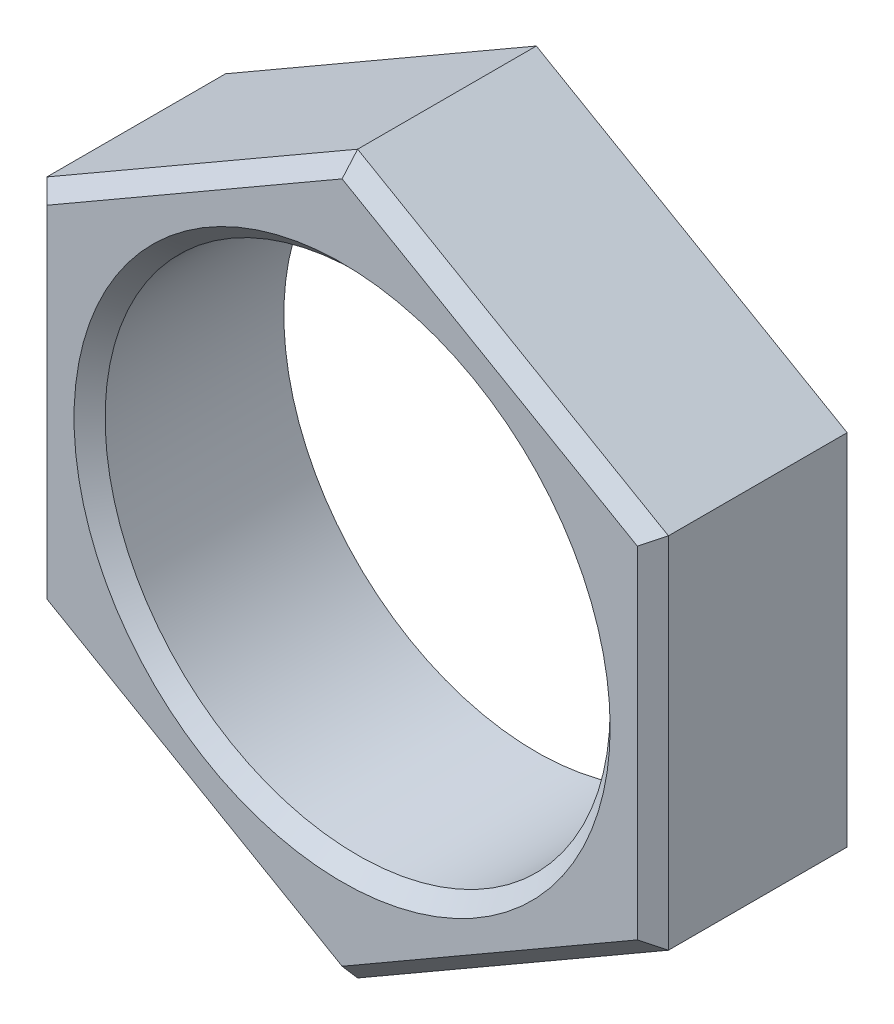
ISO-10303-21;
HEADER;
FILE_DESCRIPTION(('STEP AP214'),'2;1');
FILE_NAME('part.step','',(''),(''),'','','');
FILE_SCHEMA(('AUTOMOTIVE_DESIGN { 1 0 10303 214 1 1 1 1 }'));
ENDSEC;
DATA;
#1=APPLICATION_CONTEXT('core data for automotive mechanical design processes');
#2=APPLICATION_PROTOCOL_DEFINITION('international standard','automotive_design',2000,#1);
#3=PRODUCT_CONTEXT('',#1,'mechanical');
#4=PRODUCT('Part','Part','',(#3));
#5=PRODUCT_RELATED_PRODUCT_CATEGORY('part','',(#4));
#6=PRODUCT_DEFINITION_FORMATION('','',#4);
#7=PRODUCT_DEFINITION_CONTEXT('part definition',#1,'design');
#8=PRODUCT_DEFINITION('design','',#6,#7);
#9=PRODUCT_DEFINITION_SHAPE('','',#8);
#10=(LENGTH_UNIT() NAMED_UNIT(*) SI_UNIT(.MILLI.,.METRE.));
#11=(NAMED_UNIT(*) PLANE_ANGLE_UNIT() SI_UNIT($,.RADIAN.));
#12=(NAMED_UNIT(*) SI_UNIT($,.STERADIAN.) SOLID_ANGLE_UNIT());
#13=UNCERTAINTY_MEASURE_WITH_UNIT(LENGTH_MEASURE(1.E-05),#10,'distance_accuracy_value','');
#14=(GEOMETRIC_REPRESENTATION_CONTEXT(3) GLOBAL_UNCERTAINTY_ASSIGNED_CONTEXT((#13)) GLOBAL_UNIT_ASSIGNED_CONTEXT((#10,
#11,#12)) REPRESENTATION_CONTEXT('',''));
#15=CARTESIAN_POINT('',(0.,0.,0.));
#16=DIRECTION('',(0.,0.,1.));
#17=DIRECTION('',(1.,0.,0.));
#18=AXIS2_PLACEMENT_3D('',#15,#16,#17);
#19=CARTESIAN_POINT('',(0.,0.,15.875));
#20=DIRECTION('',(0.,0.,1.));
#21=DIRECTION('',(1.,0.,0.));
#22=AXIS2_PLACEMENT_3D('',#19,#20,#21);
#23=PLANE('',#22);
#24=CARTESIAN_POINT('',(0.,0.,15.875));
#25=DIRECTION('',(0.,0.,1.));
#26=DIRECTION('',(1.,0.,0.));
#27=AXIS2_PLACEMENT_3D('',#24,#25,#26);
#28=CIRCLE('',#27,21.9075);
#29=CARTESIAN_POINT('',(21.9075,0.,15.875));
#30=VERTEX_POINT('',#29);
#31=EDGE_CURVE('E164',#30,#30,#28,.F.);
#32=ORIENTED_EDGE('',*,*,#31,.T.);
#33=EDGE_LOOP('',(#32));
#34=FACE_BOUND('',#33,.T.);
#35=DIRECTION('',(0.866025403784439,0.5,0.));
#36=VECTOR('',#35,1.);
#37=CARTESIAN_POINT('',(24.765,-13.5648445746103,15.875));
#38=LINE('',#37,#36);
#39=CARTESIAN_POINT('',(0.,-27.8629239910914,15.875));
#40=VERTEX_POINT('',#39);
#41=CARTESIAN_POINT('',(24.13,-13.9314619955457,15.875));
#42=VERTEX_POINT('',#41);
#43=EDGE_CURVE('E159',#40,#42,#38,.T.);
#44=ORIENTED_EDGE('',*,*,#43,.T.);
#45=DIRECTION('',(0.,1.,0.));
#46=VECTOR('',#45,1.);
#47=CARTESIAN_POINT('',(24.13,14.6646968374165,15.875));
#48=LINE('',#47,#46);
#49=CARTESIAN_POINT('',(24.13,13.9314619955457,15.875));
#50=VERTEX_POINT('',#49);
#51=EDGE_CURVE('E161',#42,#50,#48,.T.);
#52=ORIENTED_EDGE('',*,*,#51,.T.);
#53=DIRECTION('',(-0.866025403784439,0.5,0.));
#54=VECTOR('',#53,1.);
#55=CARTESIAN_POINT('',(-0.634999999999995,28.2295414120268,15.875));
#56=LINE('',#55,#54);
#57=CARTESIAN_POINT('',(0.,27.8629239910913,15.875));
#58=VERTEX_POINT('',#57);
#59=EDGE_CURVE('E151',#50,#58,#56,.T.);
#60=ORIENTED_EDGE('',*,*,#59,.T.);
#61=DIRECTION('',(-0.866025403784439,-0.5,0.));
#62=VECTOR('',#61,1.);
#63=CARTESIAN_POINT('',(-24.765,13.5648445746103,15.875));
#64=LINE('',#63,#62);
#65=CARTESIAN_POINT('',(-24.13,13.9314619955457,15.875));
#66=VERTEX_POINT('',#65);
#67=EDGE_CURVE('E153',#58,#66,#64,.T.);
#68=ORIENTED_EDGE('',*,*,#67,.T.);
#69=DIRECTION('',(0.,-1.,0.));
#70=VECTOR('',#69,1.);
#71=CARTESIAN_POINT('',(-24.13,-14.6646968374165,15.875));
#72=LINE('',#71,#70);
#73=CARTESIAN_POINT('',(-24.13,-13.9314619955457,15.875));
#74=VERTEX_POINT('',#73);
#75=EDGE_CURVE('E155',#66,#74,#72,.T.);
#76=ORIENTED_EDGE('',*,*,#75,.T.);
#77=DIRECTION('',(0.866025403784439,-0.5,0.));
#78=VECTOR('',#77,1.);
#79=CARTESIAN_POINT('',(0.634999999999997,-28.2295414120268,15.875));
#80=LINE('',#79,#78);
#81=EDGE_CURVE('E157',#74,#40,#80,.T.);
#82=ORIENTED_EDGE('',*,*,#81,.T.);
#83=EDGE_LOOP('',(#44,#52,#60,#68,#76,#82));
#84=FACE_BOUND('',#83,.T.);
#85=ADVANCED_FACE('F32',(#34,#84),#23,.T.);
#86=CARTESIAN_POINT('',(0.,0.,0.));
#87=DIRECTION('',(0.,0.,1.));
#88=DIRECTION('',(1.,0.,0.));
#89=AXIS2_PLACEMENT_3D('',#86,#87,#88);
#90=PLANE('',#89);
#91=DIRECTION('',(-0.866025403784439,0.5,0.));
#92=VECTOR('',#91,1.);
#93=CARTESIAN_POINT('',(25.4,14.6646968374165,0.));
#94=LINE('',#93,#92);
#95=CARTESIAN_POINT('',(25.4,14.6646968374165,0.));
#96=VERTEX_POINT('',#95);
#97=CARTESIAN_POINT('',(0.,29.329393674833,0.));
#98=VERTEX_POINT('',#97);
#99=EDGE_CURVE('E118',#96,#98,#94,.T.);
#100=ORIENTED_EDGE('',*,*,#99,.F.);
#101=DIRECTION('',(0.,1.,0.));
#102=VECTOR('',#101,1.);
#103=CARTESIAN_POINT('',(25.4,-14.6646968374165,0.));
#104=LINE('',#103,#102);
#105=CARTESIAN_POINT('',(25.4,-14.6646968374165,0.));
#106=VERTEX_POINT('',#105);
#107=EDGE_CURVE('E139',#106,#96,#104,.T.);
#108=ORIENTED_EDGE('',*,*,#107,.F.);
#109=DIRECTION('',(0.866025403784439,0.5,0.));
#110=VECTOR('',#109,1.);
#111=CARTESIAN_POINT('',(0.,-29.329393674833,0.));
#112=LINE('',#111,#110);
#113=CARTESIAN_POINT('',(0.,-29.329393674833,0.));
#114=VERTEX_POINT('',#113);
#115=EDGE_CURVE('E136',#114,#106,#112,.T.);
#116=ORIENTED_EDGE('',*,*,#115,.F.);
#117=DIRECTION('',(0.866025403784439,-0.5,0.));
#118=VECTOR('',#117,1.);
#119=CARTESIAN_POINT('',(-25.4,-14.6646968374165,0.));
#120=LINE('',#119,#118);
#121=CARTESIAN_POINT('',(-25.4,-14.6646968374165,0.));
#122=VERTEX_POINT('',#121);
#123=EDGE_CURVE('E133',#122,#114,#120,.T.);
#124=ORIENTED_EDGE('',*,*,#123,.F.);
#125=DIRECTION('',(0.,-1.,0.));
#126=VECTOR('',#125,1.);
#127=CARTESIAN_POINT('',(-25.4,14.6646968374165,0.));
#128=LINE('',#127,#126);
#129=CARTESIAN_POINT('',(-25.4,14.6646968374165,0.));
#130=VERTEX_POINT('',#129);
#131=EDGE_CURVE('E121',#130,#122,#128,.T.);
#132=ORIENTED_EDGE('',*,*,#131,.F.);
#133=DIRECTION('',(-0.866025403784439,-0.5,0.));
#134=VECTOR('',#133,1.);
#135=CARTESIAN_POINT('',(0.,29.329393674833,0.));
#136=LINE('',#135,#134);
#137=EDGE_CURVE('E105',#98,#130,#136,.T.);
#138=ORIENTED_EDGE('',*,*,#137,.F.);
#139=EDGE_LOOP('',(#100,#108,#116,#124,#132,#138));
#140=FACE_BOUND('',#139,.T.);
#141=CARTESIAN_POINT('',(0.,0.,0.));
#142=DIRECTION('',(0.,0.,1.));
#143=DIRECTION('',(1.,0.,0.));
#144=AXIS2_PLACEMENT_3D('',#141,#142,#143);
#145=CIRCLE('',#144,20.6375);
#146=CARTESIAN_POINT('',(20.6375,0.,0.));
#147=VERTEX_POINT('',#146);
#148=EDGE_CURVE('E127',#147,#147,#145,.T.);
#149=ORIENTED_EDGE('',*,*,#148,.T.);
#150=EDGE_LOOP('',(#149));
#151=FACE_BOUND('',#150,.T.);
#152=ADVANCED_FACE('F115',(#140,#151),#90,.F.);
#153=CARTESIAN_POINT('',(25.4,14.6646968374165,15.875));
#154=DIRECTION('',(-0.5,-0.866025403784439,0.));
#155=DIRECTION('',(0.866025403784439,-0.5,0.));
#156=AXIS2_PLACEMENT_3D('',#153,#154,#155);
#157=PLANE('',#156);
#158=DIRECTION('',(0.,0.,-1.));
#159=VECTOR('',#158,1.);
#160=CARTESIAN_POINT('',(0.,29.329393674833,15.875));
#161=LINE('',#160,#159);
#162=CARTESIAN_POINT('',(0.,29.329393674833,14.605));
#163=VERTEX_POINT('',#162);
#164=EDGE_CURVE('E102',#163,#98,#161,.T.);
#165=ORIENTED_EDGE('',*,*,#164,.F.);
#166=DIRECTION('',(0.866025403784439,-0.5,0.));
#167=VECTOR('',#166,1.);
#168=CARTESIAN_POINT('',(25.4,14.6646968374165,14.605));
#169=LINE('',#168,#167);
#170=CARTESIAN_POINT('',(25.4,14.6646968374165,14.605));
#171=VERTEX_POINT('',#170);
#172=EDGE_CURVE('E11',#163,#171,#169,.T.);
#173=ORIENTED_EDGE('',*,*,#172,.T.);
#174=DIRECTION('',(0.,0.,-1.));
#175=VECTOR('',#174,1.);
#176=CARTESIAN_POINT('',(25.4,14.6646968374165,15.875));
#177=LINE('',#176,#175);
#178=EDGE_CURVE('E125',#171,#96,#177,.T.);
#179=ORIENTED_EDGE('',*,*,#178,.T.);
#180=ORIENTED_EDGE('',*,*,#99,.T.);
#181=EDGE_LOOP('',(#165,#173,#179,#180));
#182=FACE_BOUND('',#181,.T.);
#183=ADVANCED_FACE('F123',(#182),#157,.F.);
#184=CARTESIAN_POINT('',(0.,29.329393674833,15.875));
#185=DIRECTION('',(0.5,-0.866025403784439,0.));
#186=DIRECTION('',(0.866025403784439,0.5,0.));
#187=AXIS2_PLACEMENT_3D('',#184,#185,#186);
#188=PLANE('',#187);
#189=DIRECTION('',(0.,0.,-1.));
#190=VECTOR('',#189,1.);
#191=CARTESIAN_POINT('',(-25.4,14.6646968374165,15.875));
#192=LINE('',#191,#190);
#193=CARTESIAN_POINT('',(-25.4,14.6646968374165,14.605));
#194=VERTEX_POINT('',#193);
#195=EDGE_CURVE('E111',#194,#130,#192,.T.);
#196=ORIENTED_EDGE('',*,*,#195,.F.);
#197=DIRECTION('',(0.866025403784439,0.5,0.));
#198=VECTOR('',#197,1.);
#199=CARTESIAN_POINT('',(0.,29.329393674833,14.605));
#200=LINE('',#199,#198);
#201=EDGE_CURVE('E41',#194,#163,#200,.T.);
#202=ORIENTED_EDGE('',*,*,#201,.T.);
#203=ORIENTED_EDGE('',*,*,#164,.T.);
#204=ORIENTED_EDGE('',*,*,#137,.T.);
#205=EDGE_LOOP('',(#196,#202,#203,#204));
#206=FACE_BOUND('',#205,.T.);
#207=ADVANCED_FACE('F104',(#206),#188,.F.);
#208=CARTESIAN_POINT('',(-25.4,14.6646968374165,15.875));
#209=DIRECTION('',(1.,0.,0.));
#210=DIRECTION('',(0.,0.,-1.));
#211=AXIS2_PLACEMENT_3D('',#208,#209,#210);
#212=PLANE('',#211);
#213=DIRECTION('',(0.,0.,-1.));
#214=VECTOR('',#213,1.);
#215=CARTESIAN_POINT('',(-25.4,-14.6646968374165,15.875));
#216=LINE('',#215,#214);
#217=CARTESIAN_POINT('',(-25.4,-14.6646968374165,14.605));
#218=VERTEX_POINT('',#217);
#219=EDGE_CURVE('E146',#218,#122,#216,.T.);
#220=ORIENTED_EDGE('',*,*,#219,.F.);
#221=DIRECTION('',(0.,1.,0.));
#222=VECTOR('',#221,1.);
#223=CARTESIAN_POINT('',(-25.4,14.6646968374165,14.605));
#224=LINE('',#223,#222);
#225=EDGE_CURVE('E56',#218,#194,#224,.T.);
#226=ORIENTED_EDGE('',*,*,#225,.T.);
#227=ORIENTED_EDGE('',*,*,#195,.T.);
#228=ORIENTED_EDGE('',*,*,#131,.T.);
#229=EDGE_LOOP('',(#220,#226,#227,#228));
#230=FACE_BOUND('',#229,.T.);
#231=ADVANCED_FACE('F223',(#230),#212,.F.);
#232=CARTESIAN_POINT('',(-25.4,-14.6646968374165,15.875));
#233=DIRECTION('',(0.5,0.866025403784439,0.));
#234=DIRECTION('',(-0.866025403784439,0.5,0.));
#235=AXIS2_PLACEMENT_3D('',#232,#233,#234);
#236=PLANE('',#235);
#237=DIRECTION('',(0.,0.,-1.));
#238=VECTOR('',#237,1.);
#239=CARTESIAN_POINT('',(0.,-29.329393674833,15.875));
#240=LINE('',#239,#238);
#241=CARTESIAN_POINT('',(0.,-29.329393674833,14.605));
#242=VERTEX_POINT('',#241);
#243=EDGE_CURVE('E144',#242,#114,#240,.T.);
#244=ORIENTED_EDGE('',*,*,#243,.F.);
#245=DIRECTION('',(-0.866025403784439,0.5,0.));
#246=VECTOR('',#245,1.);
#247=CARTESIAN_POINT('',(-25.4,-14.6646968374165,14.605));
#248=LINE('',#247,#246);
#249=EDGE_CURVE('E172',#242,#218,#248,.T.);
#250=ORIENTED_EDGE('',*,*,#249,.T.);
#251=ORIENTED_EDGE('',*,*,#219,.T.);
#252=ORIENTED_EDGE('',*,*,#123,.T.);
#253=EDGE_LOOP('',(#244,#250,#251,#252));
#254=FACE_BOUND('',#253,.T.);
#255=ADVANCED_FACE('F221',(#254),#236,.F.);
#256=CARTESIAN_POINT('',(0.,-29.329393674833,15.875));
#257=DIRECTION('',(-0.5,0.866025403784439,0.));
#258=DIRECTION('',(-0.866025403784439,-0.5,0.));
#259=AXIS2_PLACEMENT_3D('',#256,#257,#258);
#260=PLANE('',#259);
#261=DIRECTION('',(0.,0.,-1.));
#262=VECTOR('',#261,1.);
#263=CARTESIAN_POINT('',(25.4,-14.6646968374165,15.875));
#264=LINE('',#263,#262);
#265=CARTESIAN_POINT('',(25.4,-14.6646968374165,14.605));
#266=VERTEX_POINT('',#265);
#267=EDGE_CURVE('E142',#266,#106,#264,.T.);
#268=ORIENTED_EDGE('',*,*,#267,.F.);
#269=DIRECTION('',(-0.866025403784439,-0.5,0.));
#270=VECTOR('',#269,1.);
#271=CARTESIAN_POINT('',(0.,-29.329393674833,14.605));
#272=LINE('',#271,#270);
#273=EDGE_CURVE('E170',#266,#242,#272,.T.);
#274=ORIENTED_EDGE('',*,*,#273,.T.);
#275=ORIENTED_EDGE('',*,*,#243,.T.);
#276=ORIENTED_EDGE('',*,*,#115,.T.);
#277=EDGE_LOOP('',(#268,#274,#275,#276));
#278=FACE_BOUND('',#277,.T.);
#279=ADVANCED_FACE('F219',(#278),#260,.F.);
#280=CARTESIAN_POINT('',(25.4,-14.6646968374165,15.875));
#281=DIRECTION('',(-1.,0.,0.));
#282=DIRECTION('',(0.,-1.,0.));
#283=AXIS2_PLACEMENT_3D('',#280,#281,#282);
#284=PLANE('',#283);
#285=ORIENTED_EDGE('',*,*,#178,.F.);
#286=DIRECTION('',(0.,-1.,0.));
#287=VECTOR('',#286,1.);
#288=CARTESIAN_POINT('',(25.4,-14.6646968374165,14.605));
#289=LINE('',#288,#287);
#290=EDGE_CURVE('E167',#171,#266,#289,.T.);
#291=ORIENTED_EDGE('',*,*,#290,.T.);
#292=ORIENTED_EDGE('',*,*,#267,.T.);
#293=ORIENTED_EDGE('',*,*,#107,.T.);
#294=EDGE_LOOP('',(#285,#291,#292,#293));
#295=FACE_BOUND('',#294,.T.);
#296=ADVANCED_FACE('F207',(#295),#284,.F.);
#297=CARTESIAN_POINT('',(0.,0.,15.875));
#298=DIRECTION('',(0.,0.,-1.));
#299=DIRECTION('',(-1.,0.,0.));
#300=AXIS2_PLACEMENT_3D('',#297,#298,#299);
#301=CYLINDRICAL_SURFACE('',#300,20.6375);
#302=CARTESIAN_POINT('',(0.,0.,14.605));
#303=DIRECTION('',(0.,0.,1.));
#304=DIRECTION('',(1.,0.,0.));
#305=AXIS2_PLACEMENT_3D('',#302,#303,#304);
#306=CIRCLE('',#305,20.6375);
#307=CARTESIAN_POINT('',(20.6375,0.,14.605));
#308=VERTEX_POINT('',#307);
#309=EDGE_CURVE('E110',#308,#308,#306,.T.);
#310=ORIENTED_EDGE('',*,*,#309,.T.);
#311=EDGE_LOOP('',(#310));
#312=FACE_BOUND('',#311,.T.);
#313=ORIENTED_EDGE('',*,*,#148,.F.);
#314=EDGE_LOOP('',(#313));
#315=FACE_BOUND('',#314,.T.);
#316=ADVANCED_FACE('F241',(#312,#315),#301,.F.);
#317=CARTESIAN_POINT('',(0.,0.,14.605));
#318=DIRECTION('',(0.,0.,1.));
#319=DIRECTION('',(1.,0.,0.));
#320=AXIS2_PLACEMENT_3D('',#317,#318,#319);
#321=CONICAL_SURFACE('',#320,20.6375,0.785398163397447);
#322=ORIENTED_EDGE('',*,*,#31,.F.);
#323=EDGE_LOOP('',(#322));
#324=FACE_BOUND('',#323,.T.);
#325=ORIENTED_EDGE('',*,*,#309,.F.);
#326=EDGE_LOOP('',(#325));
#327=FACE_BOUND('',#326,.T.);
#328=ADVANCED_FACE('F260',(#324,#327),#321,.F.);
#329=CARTESIAN_POINT('',(-24.13,0.,15.875));
#330=DIRECTION('',(-0.707106781186549,0.,0.707106781186546));
#331=DIRECTION('',(0.,1.,0.));
#332=AXIS2_PLACEMENT_3D('',#329,#330,#331);
#333=PLANE('',#332);
#334=DIRECTION('',(0.654653670707974,-0.377964473009231,0.654653670707978));
#335=VECTOR('',#334,1.);
#336=CARTESIAN_POINT('',(-20.6828571428572,11.9412531390391,19.3221428571428));
#337=LINE('',#336,#335);
#338=EDGE_CURVE('E185',#194,#66,#337,.T.);
#339=ORIENTED_EDGE('',*,*,#338,.F.);
#340=ORIENTED_EDGE('',*,*,#225,.F.);
#341=DIRECTION('',(0.654653670707975,0.377964473009227,0.654653670707979));
#342=VECTOR('',#341,1.);
#343=CARTESIAN_POINT('',(-20.6828571428572,-11.9412531390392,19.3221428571429));
#344=LINE('',#343,#342);
#345=EDGE_CURVE('E36',#74,#218,#344,.F.);
#346=ORIENTED_EDGE('',*,*,#345,.F.);
#347=ORIENTED_EDGE('',*,*,#75,.F.);
#348=EDGE_LOOP('',(#339,#340,#346,#347));
#349=FACE_BOUND('',#348,.T.);
#350=ADVANCED_FACE('F34',(#349),#333,.T.);
#351=CARTESIAN_POINT('',(-12.065,-20.8971929933185,15.875));
#352=DIRECTION('',(-0.353553390593275,-0.612372435695796,0.707106781186546));
#353=DIRECTION('',(-0.866025403784439,0.5,0.));
#354=AXIS2_PLACEMENT_3D('',#351,#352,#353);
#355=PLANE('',#354);
#356=ORIENTED_EDGE('',*,*,#345,.T.);
#357=ORIENTED_EDGE('',*,*,#249,.F.);
#358=DIRECTION('',(0.,0.755928946018453,0.654653670707979));
#359=VECTOR('',#358,1.);
#360=CARTESIAN_POINT('',(0.,-23.8825062780783,19.3221428571429));
#361=LINE('',#360,#359);
#362=EDGE_CURVE('E183',#40,#242,#361,.F.);
#363=ORIENTED_EDGE('',*,*,#362,.F.);
#364=ORIENTED_EDGE('',*,*,#81,.F.);
#365=EDGE_LOOP('',(#356,#357,#363,#364));
#366=FACE_BOUND('',#365,.T.);
#367=ADVANCED_FACE('F195',(#366),#355,.T.);
#368=CARTESIAN_POINT('',(-12.065,20.8971929933185,15.875));
#369=DIRECTION('',(-0.353553390593273,0.612372435695794,0.707106781186548));
#370=DIRECTION('',(0.866025403784439,0.5,0.));
#371=AXIS2_PLACEMENT_3D('',#368,#369,#370);
#372=PLANE('',#371);
#373=ORIENTED_EDGE('',*,*,#338,.T.);
#374=ORIENTED_EDGE('',*,*,#67,.F.);
#375=DIRECTION('',(0.,-0.755928946018454,0.654653670707978));
#376=VECTOR('',#375,1.);
#377=CARTESIAN_POINT('',(0.,23.8825062780783,19.3221428571429));
#378=LINE('',#377,#376);
#379=EDGE_CURVE('E180',#163,#58,#378,.T.);
#380=ORIENTED_EDGE('',*,*,#379,.F.);
#381=ORIENTED_EDGE('',*,*,#201,.F.);
#382=EDGE_LOOP('',(#373,#374,#380,#381));
#383=FACE_BOUND('',#382,.T.);
#384=ADVANCED_FACE('F199',(#383),#372,.T.);
#385=CARTESIAN_POINT('',(12.065,-20.8971929933185,15.875));
#386=DIRECTION('',(0.353553390593274,-0.612372435695796,0.707106781186546));
#387=DIRECTION('',(-0.866025403784439,-0.5,0.));
#388=AXIS2_PLACEMENT_3D('',#385,#386,#387);
#389=PLANE('',#388);
#390=ORIENTED_EDGE('',*,*,#362,.T.);
#391=ORIENTED_EDGE('',*,*,#273,.F.);
#392=DIRECTION('',(-0.654653670707976,0.377964473009226,0.654653670707979));
#393=VECTOR('',#392,1.);
#394=CARTESIAN_POINT('',(20.6828571428572,-11.9412531390392,19.3221428571429));
#395=LINE('',#394,#393);
#396=EDGE_CURVE('E178',#42,#266,#395,.F.);
#397=ORIENTED_EDGE('',*,*,#396,.F.);
#398=ORIENTED_EDGE('',*,*,#43,.F.);
#399=EDGE_LOOP('',(#390,#391,#397,#398));
#400=FACE_BOUND('',#399,.T.);
#401=ADVANCED_FACE('F216',(#400),#389,.T.);
#402=CARTESIAN_POINT('',(12.065,20.8971929933185,15.875));
#403=DIRECTION('',(0.353553390593275,0.612372435695796,0.707106781186546));
#404=DIRECTION('',(0.866025403784439,-0.5,0.));
#405=AXIS2_PLACEMENT_3D('',#402,#403,#404);
#406=PLANE('',#405);
#407=ORIENTED_EDGE('',*,*,#379,.T.);
#408=ORIENTED_EDGE('',*,*,#59,.F.);
#409=DIRECTION('',(0.654653670707976,0.377964473009226,-0.654653670707979));
#410=VECTOR('',#409,1.);
#411=CARTESIAN_POINT('',(20.6828571428571,11.9412531390392,19.3221428571429));
#412=LINE('',#411,#410);
#413=EDGE_CURVE('E176',#171,#50,#412,.F.);
#414=ORIENTED_EDGE('',*,*,#413,.F.);
#415=ORIENTED_EDGE('',*,*,#172,.F.);
#416=EDGE_LOOP('',(#407,#408,#414,#415));
#417=FACE_BOUND('',#416,.T.);
#418=ADVANCED_FACE('F204',(#417),#406,.T.);
#419=CARTESIAN_POINT('',(24.13,0.,15.875));
#420=DIRECTION('',(0.707106781186549,0.,0.707106781186546));
#421=DIRECTION('',(0.,-1.,0.));
#422=AXIS2_PLACEMENT_3D('',#419,#420,#421);
#423=PLANE('',#422);
#424=ORIENTED_EDGE('',*,*,#396,.T.);
#425=ORIENTED_EDGE('',*,*,#290,.F.);
#426=ORIENTED_EDGE('',*,*,#413,.T.);
#427=ORIENTED_EDGE('',*,*,#51,.F.);
#428=EDGE_LOOP('',(#424,#425,#426,#427));
#429=FACE_BOUND('',#428,.T.);
#430=ADVANCED_FACE('F210',(#429),#423,.T.);
#431=CLOSED_SHELL('',(#85,#152,#183,#207,#231,#255,#279,#296,#316,#328,#350,#367,#384,#401,#418,#430));
#432=MANIFOLD_SOLID_BREP('B2',#431);
#433=ADVANCED_BREP_SHAPE_REPRESENTATION('',(#18,#432),#14);
#434=SHAPE_DEFINITION_REPRESENTATION(#9,#433);
ENDSEC;
END-ISO-10303-21;
